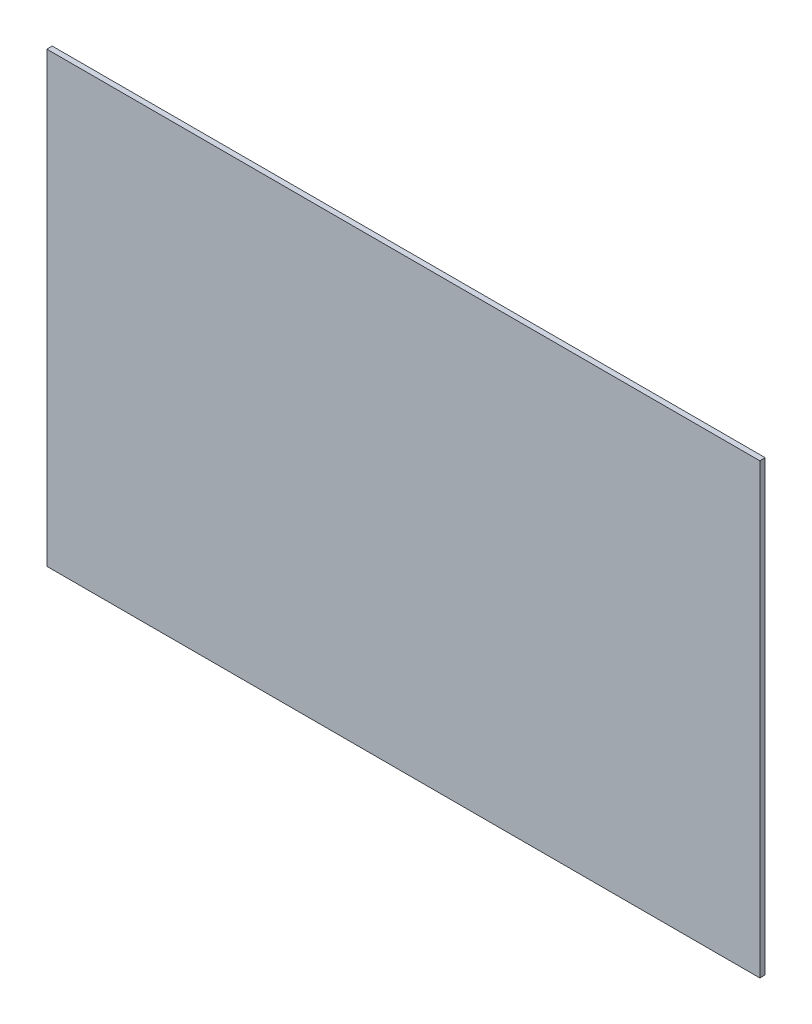
ISO-10303-21;
HEADER;
FILE_DESCRIPTION(('STEP AP214'),'2;1');
FILE_NAME('part.step','',(''),(''),'','','');
FILE_SCHEMA(('AUTOMOTIVE_DESIGN { 1 0 10303 214 1 1 1 1 }'));
ENDSEC;
DATA;
#1=APPLICATION_CONTEXT('core data for automotive mechanical design processes');
#2=APPLICATION_PROTOCOL_DEFINITION('international standard','automotive_design',2000,#1);
#3=PRODUCT_CONTEXT('',#1,'mechanical');
#4=PRODUCT('Part','Part','',(#3));
#5=PRODUCT_RELATED_PRODUCT_CATEGORY('part','',(#4));
#6=PRODUCT_DEFINITION_FORMATION('','',#4);
#7=PRODUCT_DEFINITION_CONTEXT('part definition',#1,'design');
#8=PRODUCT_DEFINITION('design','',#6,#7);
#9=PRODUCT_DEFINITION_SHAPE('','',#8);
#10=(LENGTH_UNIT() NAMED_UNIT(*) SI_UNIT(.MILLI.,.METRE.));
#11=(NAMED_UNIT(*) PLANE_ANGLE_UNIT() SI_UNIT($,.RADIAN.));
#12=(NAMED_UNIT(*) SI_UNIT($,.STERADIAN.) SOLID_ANGLE_UNIT());
#13=UNCERTAINTY_MEASURE_WITH_UNIT(LENGTH_MEASURE(1.E-05),#10,'distance_accuracy_value','');
#14=(GEOMETRIC_REPRESENTATION_CONTEXT(3) GLOBAL_UNCERTAINTY_ASSIGNED_CONTEXT((#13)) GLOBAL_UNIT_ASSIGNED_CONTEXT((#10,
#11,#12)) REPRESENTATION_CONTEXT('',''));
#15=CARTESIAN_POINT('',(0.,0.,0.));
#16=DIRECTION('',(0.,0.,1.));
#17=DIRECTION('',(1.,0.,0.));
#18=AXIS2_PLACEMENT_3D('',#15,#16,#17);
#19=CARTESIAN_POINT('',(0.,0.,3.));
#20=DIRECTION('',(-1.,0.,0.));
#21=DIRECTION('',(0.,0.,1.));
#22=AXIS2_PLACEMENT_3D('',#19,#20,#21);
#23=PLANE('',#22);
#24=DIRECTION('',(0.,1.,0.));
#25=VECTOR('',#24,1.);
#26=CARTESIAN_POINT('',(0.,0.,0.));
#27=LINE('',#26,#25);
#28=CARTESIAN_POINT('',(0.,0.,0.));
#29=VERTEX_POINT('',#28);
#30=CARTESIAN_POINT('',(0.,250.,0.));
#31=VERTEX_POINT('',#30);
#32=EDGE_CURVE('E107',#29,#31,#27,.T.);
#33=ORIENTED_EDGE('',*,*,#32,.T.);
#34=DIRECTION('',(0.,0.,-1.));
#35=VECTOR('',#34,1.);
#36=CARTESIAN_POINT('',(0.,250.,3.));
#37=LINE('',#36,#35);
#38=CARTESIAN_POINT('',(0.,250.,3.));
#39=VERTEX_POINT('',#38);
#40=EDGE_CURVE('E11',#39,#31,#37,.T.);
#41=ORIENTED_EDGE('',*,*,#40,.F.);
#42=DIRECTION('',(0.,1.,0.));
#43=VECTOR('',#42,1.);
#44=CARTESIAN_POINT('',(0.,0.,3.));
#45=LINE('',#44,#43);
#46=CARTESIAN_POINT('',(0.,0.,3.));
#47=VERTEX_POINT('',#46);
#48=EDGE_CURVE('E91',#47,#39,#45,.T.);
#49=ORIENTED_EDGE('',*,*,#48,.F.);
#50=DIRECTION('',(0.,0.,-1.));
#51=VECTOR('',#50,1.);
#52=CARTESIAN_POINT('',(0.,0.,3.));
#53=LINE('',#52,#51);
#54=EDGE_CURVE('E103',#47,#29,#53,.T.);
#55=ORIENTED_EDGE('',*,*,#54,.T.);
#56=EDGE_LOOP('',(#33,#41,#49,#55));
#57=FACE_BOUND('',#56,.T.);
#58=ADVANCED_FACE('F39',(#57),#23,.F.);
#59=CARTESIAN_POINT('',(0.,250.,3.));
#60=DIRECTION('',(0.,-1.,0.));
#61=DIRECTION('',(1.,0.,0.));
#62=AXIS2_PLACEMENT_3D('',#59,#60,#61);
#63=PLANE('',#62);
#64=DIRECTION('',(-1.,0.,0.));
#65=VECTOR('',#64,1.);
#66=CARTESIAN_POINT('',(0.,250.,0.));
#67=LINE('',#66,#65);
#68=CARTESIAN_POINT('',(-398.,250.,0.));
#69=VERTEX_POINT('',#68);
#70=EDGE_CURVE('E96',#31,#69,#67,.T.);
#71=ORIENTED_EDGE('',*,*,#70,.T.);
#72=DIRECTION('',(0.,0.,-1.));
#73=VECTOR('',#72,1.);
#74=CARTESIAN_POINT('',(-398.,250.,3.));
#75=LINE('',#74,#73);
#76=CARTESIAN_POINT('',(-398.,250.,3.));
#77=VERTEX_POINT('',#76);
#78=EDGE_CURVE('E48',#77,#69,#75,.T.);
#79=ORIENTED_EDGE('',*,*,#78,.F.);
#80=DIRECTION('',(-1.,0.,0.));
#81=VECTOR('',#80,1.);
#82=CARTESIAN_POINT('',(0.,250.,3.));
#83=LINE('',#82,#81);
#84=EDGE_CURVE('E86',#39,#77,#83,.T.);
#85=ORIENTED_EDGE('',*,*,#84,.F.);
#86=ORIENTED_EDGE('',*,*,#40,.T.);
#87=EDGE_LOOP('',(#71,#79,#85,#86));
#88=FACE_BOUND('',#87,.T.);
#89=ADVANCED_FACE('F95',(#88),#63,.F.);
#90=CARTESIAN_POINT('',(-398.,0.,3.));
#91=DIRECTION('',(1.,0.,0.));
#92=DIRECTION('',(0.,0.,-1.));
#93=AXIS2_PLACEMENT_3D('',#90,#91,#92);
#94=PLANE('',#93);
#95=DIRECTION('',(0.,-1.,0.));
#96=VECTOR('',#95,1.);
#97=CARTESIAN_POINT('',(-398.,0.,0.));
#98=LINE('',#97,#96);
#99=CARTESIAN_POINT('',(-398.,0.,0.));
#100=VERTEX_POINT('',#99);
#101=EDGE_CURVE('E73',#69,#100,#98,.T.);
#102=ORIENTED_EDGE('',*,*,#101,.T.);
#103=DIRECTION('',(0.,0.,-1.));
#104=VECTOR('',#103,1.);
#105=CARTESIAN_POINT('',(-398.,0.,3.));
#106=LINE('',#105,#104);
#107=CARTESIAN_POINT('',(-398.,0.,3.));
#108=VERTEX_POINT('',#107);
#109=EDGE_CURVE('E98',#108,#100,#106,.T.);
#110=ORIENTED_EDGE('',*,*,#109,.F.);
#111=DIRECTION('',(0.,-1.,0.));
#112=VECTOR('',#111,1.);
#113=CARTESIAN_POINT('',(-398.,0.,3.));
#114=LINE('',#113,#112);
#115=EDGE_CURVE('E89',#77,#108,#114,.T.);
#116=ORIENTED_EDGE('',*,*,#115,.F.);
#117=ORIENTED_EDGE('',*,*,#78,.T.);
#118=EDGE_LOOP('',(#102,#110,#116,#117));
#119=FACE_BOUND('',#118,.T.);
#120=ADVANCED_FACE('F99',(#119),#94,.F.);
#121=CARTESIAN_POINT('',(0.,0.,3.));
#122=DIRECTION('',(0.,1.,0.));
#123=DIRECTION('',(-1.,0.,0.));
#124=AXIS2_PLACEMENT_3D('',#121,#122,#123);
#125=PLANE('',#124);
#126=DIRECTION('',(1.,0.,0.));
#127=VECTOR('',#126,1.);
#128=CARTESIAN_POINT('',(0.,0.,0.));
#129=LINE('',#128,#127);
#130=EDGE_CURVE('E79',#100,#29,#129,.T.);
#131=ORIENTED_EDGE('',*,*,#130,.T.);
#132=ORIENTED_EDGE('',*,*,#54,.F.);
#133=DIRECTION('',(1.,0.,0.));
#134=VECTOR('',#133,1.);
#135=CARTESIAN_POINT('',(0.,0.,3.));
#136=LINE('',#135,#134);
#137=EDGE_CURVE('E56',#108,#47,#136,.T.);
#138=ORIENTED_EDGE('',*,*,#137,.F.);
#139=ORIENTED_EDGE('',*,*,#109,.T.);
#140=EDGE_LOOP('',(#131,#132,#138,#139));
#141=FACE_BOUND('',#140,.T.);
#142=ADVANCED_FACE('F120',(#141),#125,.F.);
#143=CARTESIAN_POINT('',(0.,0.,3.));
#144=DIRECTION('',(0.,0.,1.));
#145=DIRECTION('',(1.,0.,0.));
#146=AXIS2_PLACEMENT_3D('',#143,#144,#145);
#147=PLANE('',#146);
#148=ORIENTED_EDGE('',*,*,#48,.T.);
#149=ORIENTED_EDGE('',*,*,#84,.T.);
#150=ORIENTED_EDGE('',*,*,#115,.T.);
#151=ORIENTED_EDGE('',*,*,#137,.T.);
#152=EDGE_LOOP('',(#148,#149,#150,#151));
#153=FACE_BOUND('',#152,.T.);
#154=ADVANCED_FACE('F87',(#153),#147,.T.);
#155=CARTESIAN_POINT('',(0.,0.,0.));
#156=DIRECTION('',(0.,0.,1.));
#157=DIRECTION('',(1.,0.,0.));
#158=AXIS2_PLACEMENT_3D('',#155,#156,#157);
#159=PLANE('',#158);
#160=ORIENTED_EDGE('',*,*,#32,.F.);
#161=ORIENTED_EDGE('',*,*,#130,.F.);
#162=ORIENTED_EDGE('',*,*,#101,.F.);
#163=ORIENTED_EDGE('',*,*,#70,.F.);
#164=EDGE_LOOP('',(#160,#161,#162,#163));
#165=FACE_BOUND('',#164,.T.);
#166=ADVANCED_FACE('F123',(#165),#159,.F.);
#167=CLOSED_SHELL('',(#58,#89,#120,#142,#154,#166));
#168=MANIFOLD_SOLID_BREP('B2',#167);
#169=ADVANCED_BREP_SHAPE_REPRESENTATION('',(#18,#168),#14);
#170=SHAPE_DEFINITION_REPRESENTATION(#9,#169);
ENDSEC;
END-ISO-10303-21;
